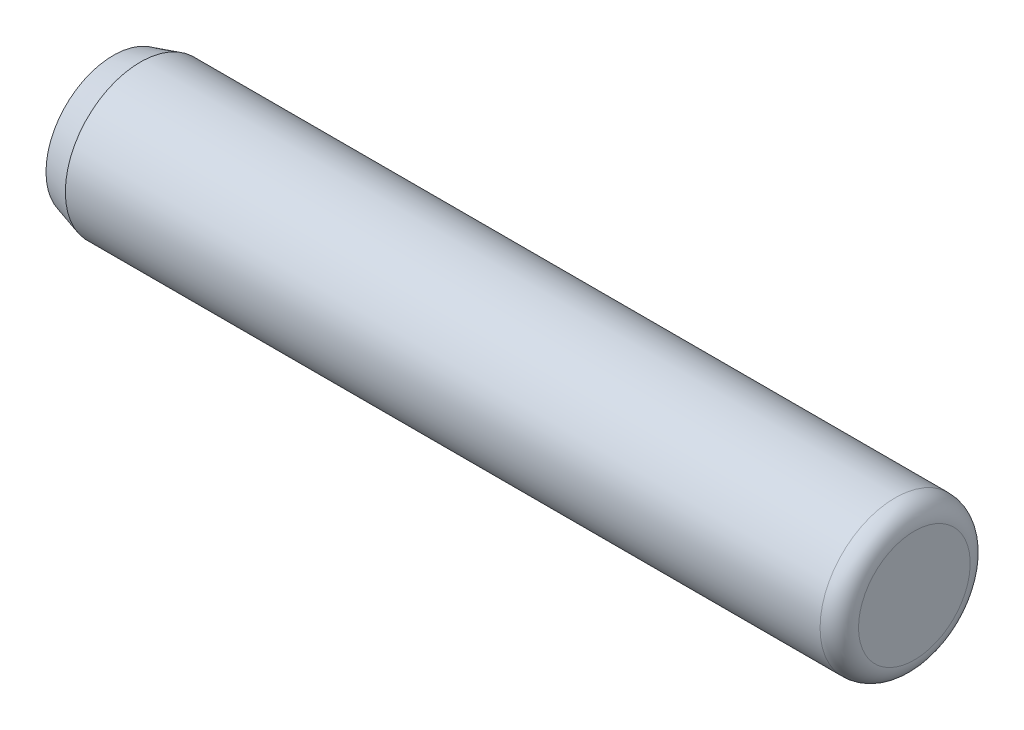
ISO-10303-21;
HEADER;
FILE_DESCRIPTION(('STEP AP214'),'2;1');
FILE_NAME('part.step','',(''),(''),'','','');
FILE_SCHEMA(('AUTOMOTIVE_DESIGN { 1 0 10303 214 1 1 1 1 }'));
ENDSEC;
DATA;
#1=APPLICATION_CONTEXT('core data for automotive mechanical design processes');
#2=APPLICATION_PROTOCOL_DEFINITION('international standard','automotive_design',2000,#1);
#3=PRODUCT_CONTEXT('',#1,'mechanical');
#4=PRODUCT('Part','Part','',(#3));
#5=PRODUCT_RELATED_PRODUCT_CATEGORY('part','',(#4));
#6=PRODUCT_DEFINITION_FORMATION('','',#4);
#7=PRODUCT_DEFINITION_CONTEXT('part definition',#1,'design');
#8=PRODUCT_DEFINITION('design','',#6,#7);
#9=PRODUCT_DEFINITION_SHAPE('','',#8);
#10=(LENGTH_UNIT() NAMED_UNIT(*) SI_UNIT(.MILLI.,.METRE.));
#11=(NAMED_UNIT(*) PLANE_ANGLE_UNIT() SI_UNIT($,.RADIAN.));
#12=(NAMED_UNIT(*) SI_UNIT($,.STERADIAN.) SOLID_ANGLE_UNIT());
#13=UNCERTAINTY_MEASURE_WITH_UNIT(LENGTH_MEASURE(1.E-05),#10,'distance_accuracy_value','');
#14=(GEOMETRIC_REPRESENTATION_CONTEXT(3) GLOBAL_UNCERTAINTY_ASSIGNED_CONTEXT((#13)) GLOBAL_UNIT_ASSIGNED_CONTEXT((#10,
#11,#12)) REPRESENTATION_CONTEXT('',''));
#15=CARTESIAN_POINT('',(0.,0.,0.));
#16=DIRECTION('',(0.,0.,1.));
#17=DIRECTION('',(1.,0.,0.));
#18=AXIS2_PLACEMENT_3D('',#15,#16,#17);
#19=CARTESIAN_POINT('',(6.0452,0.,0.));
#20=DIRECTION('',(-1.,0.,0.));
#21=DIRECTION('',(0.,0.,1.));
#22=AXIS2_PLACEMENT_3D('',#19,#20,#21);
#23=TOROIDAL_SURFACE('',#22,0.88519,0.304800000000001);
#24=CARTESIAN_POINT('',(6.0452,0.,0.));
#25=DIRECTION('',(-1.,0.,0.));
#26=DIRECTION('',(0.,0.,1.));
#27=AXIS2_PLACEMENT_3D('',#24,#25,#26);
#28=CIRCLE('',#27,1.18999);
#29=CARTESIAN_POINT('',(6.0452,0.,1.18999));
#30=VERTEX_POINT('',#29);
#31=EDGE_CURVE('E10',#30,#30,#28,.T.);
#32=ORIENTED_EDGE('',*,*,#31,.F.);
#33=EDGE_LOOP('',(#32));
#34=FACE_BOUND('',#33,.T.);
#35=CARTESIAN_POINT('',(6.35,0.,0.));
#36=DIRECTION('',(-1.,0.,0.));
#37=DIRECTION('',(0.,0.,1.));
#38=AXIS2_PLACEMENT_3D('',#35,#36,#37);
#39=CIRCLE('',#38,0.88519);
#40=CARTESIAN_POINT('',(6.35,0.,0.88519));
#41=VERTEX_POINT('',#40);
#42=EDGE_CURVE('E51',#41,#41,#39,.T.);
#43=ORIENTED_EDGE('',*,*,#42,.T.);
#44=EDGE_LOOP('',(#43));
#45=FACE_BOUND('',#44,.T.);
#46=ADVANCED_FACE('F37',(#34,#45),#23,.T.);
#47=CARTESIAN_POINT('',(-6.35,0.,0.));
#48=DIRECTION('',(-1.,0.,0.));
#49=DIRECTION('',(0.,0.,1.));
#50=AXIS2_PLACEMENT_3D('',#47,#48,#49);
#51=CYLINDRICAL_SURFACE('',#50,1.18999);
#52=CARTESIAN_POINT('',(-5.92038541466324,0.,0.));
#53=DIRECTION('',(-1.,0.,0.));
#54=DIRECTION('',(0.,0.,1.));
#55=AXIS2_PLACEMENT_3D('',#52,#53,#54);
#56=CIRCLE('',#55,1.18999);
#57=CARTESIAN_POINT('',(-5.92038541466324,0.,1.18999));
#58=VERTEX_POINT('',#57);
#59=EDGE_CURVE('E43',#58,#58,#56,.T.);
#60=ORIENTED_EDGE('',*,*,#59,.F.);
#61=EDGE_LOOP('',(#60));
#62=FACE_BOUND('',#61,.T.);
#63=ORIENTED_EDGE('',*,*,#31,.T.);
#64=EDGE_LOOP('',(#63));
#65=FACE_BOUND('',#64,.T.);
#66=ADVANCED_FACE('F69',(#62,#65),#51,.T.);
#67=CARTESIAN_POINT('',(-5.92038541466324,0.,0.));
#68=DIRECTION('',(1.,0.,0.));
#69=DIRECTION('',(0.,0.,-1.));
#70=AXIS2_PLACEMENT_3D('',#67,#68,#69);
#71=CONICAL_SURFACE('',#70,1.18999,0.279252680319095);
#72=CARTESIAN_POINT('',(-6.35,0.,0.));
#73=DIRECTION('',(-1.,0.,0.));
#74=DIRECTION('',(0.,0.,1.));
#75=AXIS2_PLACEMENT_3D('',#72,#73,#74);
#76=CIRCLE('',#75,1.0668);
#77=CARTESIAN_POINT('',(-6.35,0.,1.0668));
#78=VERTEX_POINT('',#77);
#79=EDGE_CURVE('E47',#78,#78,#76,.T.);
#80=ORIENTED_EDGE('',*,*,#79,.F.);
#81=EDGE_LOOP('',(#80));
#82=FACE_BOUND('',#81,.T.);
#83=ORIENTED_EDGE('',*,*,#59,.T.);
#84=EDGE_LOOP('',(#83));
#85=FACE_BOUND('',#84,.T.);
#86=ADVANCED_FACE('F65',(#82,#85),#71,.T.);
#87=CARTESIAN_POINT('',(-6.35,1.0668,0.));
#88=DIRECTION('',(1.,0.,0.));
#89=DIRECTION('',(0.,0.,-1.));
#90=AXIS2_PLACEMENT_3D('',#87,#88,#89);
#91=PLANE('',#90);
#92=ORIENTED_EDGE('',*,*,#79,.T.);
#93=EDGE_LOOP('',(#92));
#94=FACE_BOUND('',#93,.T.);
#95=ADVANCED_FACE('F60',(#94),#91,.F.);
#96=CARTESIAN_POINT('',(6.35,0.88519,0.));
#97=DIRECTION('',(-1.,0.,0.));
#98=DIRECTION('',(0.,0.,1.));
#99=AXIS2_PLACEMENT_3D('',#96,#97,#98);
#100=PLANE('',#99);
#101=ORIENTED_EDGE('',*,*,#42,.F.);
#102=EDGE_LOOP('',(#101));
#103=FACE_BOUND('',#102,.T.);
#104=ADVANCED_FACE('F58',(#103),#100,.F.);
#105=CLOSED_SHELL('',(#46,#66,#86,#95,#104));
#106=MANIFOLD_SOLID_BREP('B2',#105);
#107=ADVANCED_BREP_SHAPE_REPRESENTATION('',(#18,#106),#14);
#108=SHAPE_DEFINITION_REPRESENTATION(#9,#107);
ENDSEC;
END-ISO-10303-21;
